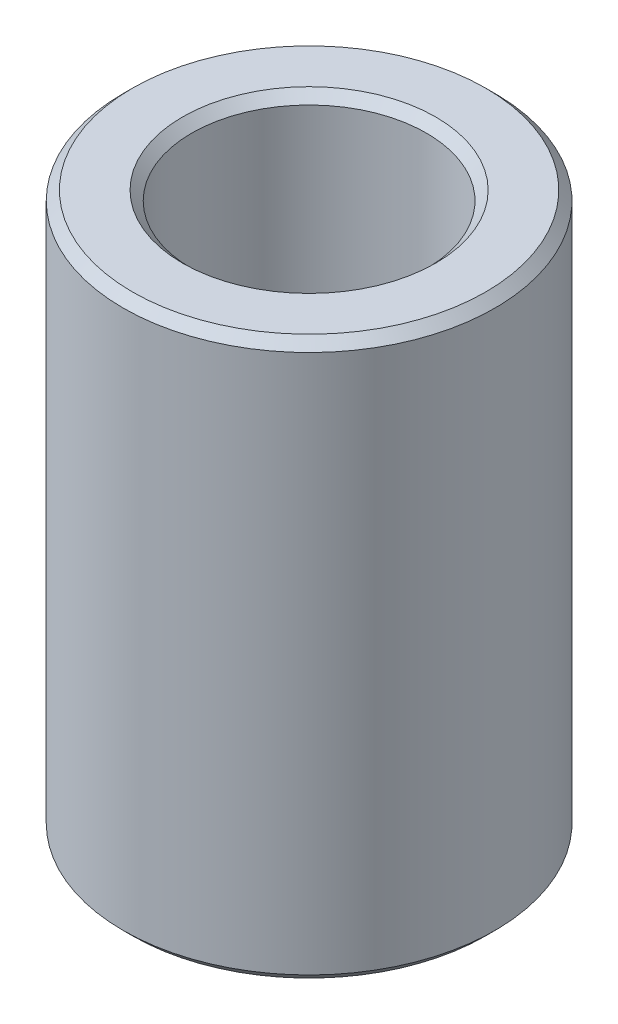
ISO-10303-21;
HEADER;
FILE_DESCRIPTION(('STEP AP214'),'2;1');
FILE_NAME('part.step','',(''),(''),'','','');
FILE_SCHEMA(('AUTOMOTIVE_DESIGN { 1 0 10303 214 1 1 1 1 }'));
ENDSEC;
DATA;
#1=APPLICATION_CONTEXT('core data for automotive mechanical design processes');
#2=APPLICATION_PROTOCOL_DEFINITION('international standard','automotive_design',2000,#1);
#3=PRODUCT_CONTEXT('',#1,'mechanical');
#4=PRODUCT('Part','Part','',(#3));
#5=PRODUCT_RELATED_PRODUCT_CATEGORY('part','',(#4));
#6=PRODUCT_DEFINITION_FORMATION('','',#4);
#7=PRODUCT_DEFINITION_CONTEXT('part definition',#1,'design');
#8=PRODUCT_DEFINITION('design','',#6,#7);
#9=PRODUCT_DEFINITION_SHAPE('','',#8);
#10=(LENGTH_UNIT() NAMED_UNIT(*) SI_UNIT(.MILLI.,.METRE.));
#11=(NAMED_UNIT(*) PLANE_ANGLE_UNIT() SI_UNIT($,.RADIAN.));
#12=(NAMED_UNIT(*) SI_UNIT($,.STERADIAN.) SOLID_ANGLE_UNIT());
#13=UNCERTAINTY_MEASURE_WITH_UNIT(LENGTH_MEASURE(1.E-05),#10,'distance_accuracy_value','');
#14=(GEOMETRIC_REPRESENTATION_CONTEXT(3) GLOBAL_UNCERTAINTY_ASSIGNED_CONTEXT((#13)) GLOBAL_UNIT_ASSIGNED_CONTEXT((#10,
#11,#12)) REPRESENTATION_CONTEXT('',''));
#15=CARTESIAN_POINT('',(0.,0.,0.));
#16=DIRECTION('',(0.,0.,1.));
#17=DIRECTION('',(1.,0.,0.));
#18=AXIS2_PLACEMENT_3D('',#15,#16,#17);
#19=CARTESIAN_POINT('',(0.,0.1000000001101,0.));
#20=DIRECTION('',(0.,-1.,0.));
#21=DIRECTION('',(0.,0.,-1.));
#22=AXIS2_PLACEMENT_3D('',#19,#20,#21);
#23=CONICAL_SURFACE('',#22,2.62499999989,0.785398163397448);
#24=CARTESIAN_POINT('',(0.,0.2,0.));
#25=DIRECTION('',(0.,1.,0.));
#26=DIRECTION('',(-1.,0.,0.));
#27=AXIS2_PLACEMENT_3D('',#24,#25,#26);
#28=CIRCLE('',#27,2.525);
#29=CARTESIAN_POINT('',(0.,0.20000000000005,2.52500000000005));
#30=VERTEX_POINT('',#29);
#31=CARTESIAN_POINT('',(-2.525,0.2,0.));
#32=VERTEX_POINT('',#31);
#33=EDGE_CURVE('E156',#30,#32,#28,.T.);
#34=ORIENTED_EDGE('',*,*,#33,.T.);
#35=CARTESIAN_POINT('',(0.,0.2,0.));
#36=DIRECTION('',(0.,1.,0.));
#37=DIRECTION('',(-1.,0.,0.));
#38=AXIS2_PLACEMENT_3D('',#35,#36,#37);
#39=CIRCLE('',#38,2.525);
#40=EDGE_CURVE('E158',#32,#30,#39,.T.);
#41=ORIENTED_EDGE('',*,*,#40,.T.);
#42=DIRECTION('',(0.,-0.707106781186548,0.707106781186548));
#43=VECTOR('',#42,1.);
#44=CARTESIAN_POINT('',(0.,0.1000000001101,2.62499999989));
#45=LINE('',#44,#43);
#46=CARTESIAN_POINT('',(0.,0.,2.72500000000005));
#47=VERTEX_POINT('',#46);
#48=EDGE_CURVE('E11',#30,#47,#45,.T.);
#49=ORIENTED_EDGE('',*,*,#48,.T.);
#50=CARTESIAN_POINT('',(0.,0.,0.));
#51=DIRECTION('',(0.,1.,0.));
#52=DIRECTION('',(1.,0.,0.));
#53=AXIS2_PLACEMENT_3D('',#50,#51,#52);
#54=CIRCLE('',#53,2.725);
#55=EDGE_CURVE('E167',#47,#47,#54,.T.);
#56=ORIENTED_EDGE('',*,*,#55,.F.);
#57=ORIENTED_EDGE('',*,*,#48,.F.);
#58=EDGE_LOOP('',(#34,#41,#49,#56,#57));
#59=FACE_BOUND('',#58,.T.);
#60=ADVANCED_FACE('F17',(#59),#23,.F.);
#61=CARTESIAN_POINT('',(0.,-0.6,0.));
#62=DIRECTION('',(0.,1.,0.));
#63=DIRECTION('',(1.,0.,0.));
#64=AXIS2_PLACEMENT_3D('',#61,#62,#63);
#65=CYLINDRICAL_SURFACE('',#64,2.525);
#66=ORIENTED_EDGE('',*,*,#33,.F.);
#67=ORIENTED_EDGE('',*,*,#40,.F.);
#68=DIRECTION('',(0.,1.,0.));
#69=VECTOR('',#68,1.);
#70=CARTESIAN_POINT('',(-2.525,-0.6,0.));
#71=LINE('',#70,#69);
#72=CARTESIAN_POINT('',(-2.525,4.,0.));
#73=VERTEX_POINT('',#72);
#74=EDGE_CURVE('E27',#32,#73,#71,.T.);
#75=ORIENTED_EDGE('',*,*,#74,.T.);
#76=CARTESIAN_POINT('',(0.,4.,0.));
#77=DIRECTION('',(0.,-1.,0.));
#78=DIRECTION('',(1.,0.,0.));
#79=AXIS2_PLACEMENT_3D('',#76,#77,#78);
#80=CIRCLE('',#79,2.525);
#81=EDGE_CURVE('E159',#73,#73,#80,.T.);
#82=ORIENTED_EDGE('',*,*,#81,.F.);
#83=ORIENTED_EDGE('',*,*,#74,.F.);
#84=EDGE_LOOP('',(#66,#67,#75,#82,#83));
#85=FACE_BOUND('',#84,.T.);
#86=ADVANCED_FACE('F201',(#85),#65,.F.);
#87=CARTESIAN_POINT('',(0.,4.,0.));
#88=DIRECTION('',(0.,1.,0.));
#89=DIRECTION('',(1.,0.,0.));
#90=AXIS2_PLACEMENT_3D('',#87,#88,#89);
#91=PLANE('',#90);
#92=CARTESIAN_POINT('',(0.,4.,0.));
#93=DIRECTION('',(0.,-1.,0.));
#94=DIRECTION('',(1.,0.,0.));
#95=AXIS2_PLACEMENT_3D('',#92,#93,#94);
#96=CIRCLE('',#95,2.);
#97=CARTESIAN_POINT('',(-2.,4.,0.));
#98=VERTEX_POINT('',#97);
#99=EDGE_CURVE('E161',#98,#98,#96,.T.);
#100=ORIENTED_EDGE('',*,*,#99,.F.);
#101=EDGE_LOOP('',(#100));
#102=FACE_BOUND('',#101,.T.);
#103=ORIENTED_EDGE('',*,*,#81,.T.);
#104=EDGE_LOOP('',(#103));
#105=FACE_BOUND('',#104,.T.);
#106=ADVANCED_FACE('F206',(#102,#105),#91,.F.);
#107=CARTESIAN_POINT('',(0.,-0.6,0.));
#108=DIRECTION('',(0.,1.,0.));
#109=DIRECTION('',(1.,0.,0.));
#110=AXIS2_PLACEMENT_3D('',#107,#108,#109);
#111=CYLINDRICAL_SURFACE('',#110,2.);
#112=ORIENTED_EDGE('',*,*,#99,.T.);
#113=DIRECTION('',(0.,1.,0.));
#114=VECTOR('',#113,1.);
#115=CARTESIAN_POINT('',(-2.,-0.6,0.));
#116=LINE('',#115,#114);
#117=CARTESIAN_POINT('',(-2.,5.,0.));
#118=VERTEX_POINT('',#117);
#119=EDGE_CURVE('E164',#98,#118,#116,.T.);
#120=ORIENTED_EDGE('',*,*,#119,.T.);
#121=CARTESIAN_POINT('',(0.,5.,0.));
#122=DIRECTION('',(0.,-1.,0.));
#123=DIRECTION('',(1.,0.,0.));
#124=AXIS2_PLACEMENT_3D('',#121,#122,#123);
#125=CIRCLE('',#124,2.);
#126=EDGE_CURVE('E165',#118,#118,#125,.T.);
#127=ORIENTED_EDGE('',*,*,#126,.F.);
#128=ORIENTED_EDGE('',*,*,#119,.F.);
#129=EDGE_LOOP('',(#112,#120,#127,#128));
#130=FACE_BOUND('',#129,.T.);
#131=ADVANCED_FACE('F225',(#130),#111,.F.);
#132=CARTESIAN_POINT('',(0.,5.,0.));
#133=DIRECTION('',(0.,1.,0.));
#134=DIRECTION('',(1.,0.,0.));
#135=AXIS2_PLACEMENT_3D('',#132,#133,#134);
#136=PLANE('',#135);
#137=ORIENTED_EDGE('',*,*,#126,.T.);
#138=EDGE_LOOP('',(#137));
#139=FACE_BOUND('',#138,.T.);
#140=CARTESIAN_POINT('',(0.,5.,0.));
#141=DIRECTION('',(0.,-1.,0.));
#142=DIRECTION('',(1.,0.,0.));
#143=AXIS2_PLACEMENT_3D('',#140,#141,#142);
#144=CIRCLE('',#143,2.525);
#145=CARTESIAN_POINT('',(-2.525,5.,0.));
#146=VERTEX_POINT('',#145);
#147=EDGE_CURVE('E151',#146,#146,#144,.T.);
#148=ORIENTED_EDGE('',*,*,#147,.F.);
#149=EDGE_LOOP('',(#148));
#150=FACE_BOUND('',#149,.T.);
#151=ADVANCED_FACE('F19',(#139,#150),#136,.T.);
#152=CARTESIAN_POINT('',(0.,-0.6,0.));
#153=DIRECTION('',(0.,1.,0.));
#154=DIRECTION('',(1.,0.,0.));
#155=AXIS2_PLACEMENT_3D('',#152,#153,#154);
#156=CYLINDRICAL_SURFACE('',#155,2.525);
#157=ORIENTED_EDGE('',*,*,#147,.T.);
#158=DIRECTION('',(0.,1.,0.));
#159=VECTOR('',#158,1.);
#160=CARTESIAN_POINT('',(-2.525,-0.6,0.));
#161=LINE('',#160,#159);
#162=CARTESIAN_POINT('',(-2.525,11.8,0.));
#163=VERTEX_POINT('',#162);
#164=EDGE_CURVE('E100',#146,#163,#161,.T.);
#165=ORIENTED_EDGE('',*,*,#164,.T.);
#166=CARTESIAN_POINT('',(0.,11.8,0.));
#167=DIRECTION('',(0.,1.,0.));
#168=DIRECTION('',(-1.,0.,0.));
#169=AXIS2_PLACEMENT_3D('',#166,#167,#168);
#170=CIRCLE('',#169,2.525);
#171=CARTESIAN_POINT('',(0.,11.799999999998,2.525000000002));
#172=VERTEX_POINT('',#171);
#173=EDGE_CURVE('E149',#163,#172,#170,.T.);
#174=ORIENTED_EDGE('',*,*,#173,.T.);
#175=CARTESIAN_POINT('',(0.,11.8,0.));
#176=DIRECTION('',(0.,1.,0.));
#177=DIRECTION('',(-1.,0.,0.));
#178=AXIS2_PLACEMENT_3D('',#175,#176,#177);
#179=CIRCLE('',#178,2.525);
#180=EDGE_CURVE('E148',#172,#163,#179,.T.);
#181=ORIENTED_EDGE('',*,*,#180,.T.);
#182=ORIENTED_EDGE('',*,*,#164,.F.);
#183=EDGE_LOOP('',(#157,#165,#174,#181,#182));
#184=FACE_BOUND('',#183,.T.);
#185=ADVANCED_FACE('F194',(#184),#156,.F.);
#186=CARTESIAN_POINT('',(0.,11.89999999993,0.));
#187=DIRECTION('',(0.,1.,0.));
#188=DIRECTION('',(0.,0.,-1.));
#189=AXIS2_PLACEMENT_3D('',#186,#187,#188);
#190=CONICAL_SURFACE('',#189,2.624999999934,0.785398163397448);
#191=ORIENTED_EDGE('',*,*,#180,.F.);
#192=DIRECTION('',(0.,0.707106781186548,0.707106781186548));
#193=VECTOR('',#192,1.);
#194=CARTESIAN_POINT('',(0.,11.89999999993,2.624999999934));
#195=LINE('',#194,#193);
#196=CARTESIAN_POINT('',(0.,11.999999999998,2.725000000002));
#197=VERTEX_POINT('',#196);
#198=EDGE_CURVE('E152',#172,#197,#195,.T.);
#199=ORIENTED_EDGE('',*,*,#198,.T.);
#200=CARTESIAN_POINT('',(0.,12.,0.));
#201=DIRECTION('',(0.,1.,0.));
#202=DIRECTION('',(-1.,0.,0.));
#203=AXIS2_PLACEMENT_3D('',#200,#201,#202);
#204=CIRCLE('',#203,2.725);
#205=EDGE_CURVE('E144',#197,#197,#204,.T.);
#206=ORIENTED_EDGE('',*,*,#205,.T.);
#207=ORIENTED_EDGE('',*,*,#198,.F.);
#208=ORIENTED_EDGE('',*,*,#173,.F.);
#209=EDGE_LOOP('',(#191,#199,#206,#207,#208));
#210=FACE_BOUND('',#209,.T.);
#211=ADVANCED_FACE('F186',(#210),#190,.F.);
#212=CARTESIAN_POINT('',(0.,12.,0.));
#213=DIRECTION('',(0.,1.,0.));
#214=DIRECTION('',(1.,0.,0.));
#215=AXIS2_PLACEMENT_3D('',#212,#213,#214);
#216=PLANE('',#215);
#217=ORIENTED_EDGE('',*,*,#205,.F.);
#218=EDGE_LOOP('',(#217));
#219=FACE_BOUND('',#218,.T.);
#220=CARTESIAN_POINT('',(0.,12.,0.));
#221=DIRECTION('',(0.,1.,0.));
#222=DIRECTION('',(1.,0.,0.));
#223=AXIS2_PLACEMENT_3D('',#220,#221,#222);
#224=CIRCLE('',#223,3.8);
#225=CARTESIAN_POINT('',(0.,11.9999999999975,3.7999999999975));
#226=VERTEX_POINT('',#225);
#227=EDGE_CURVE('E119',#226,#226,#224,.T.);
#228=ORIENTED_EDGE('',*,*,#227,.T.);
#229=EDGE_LOOP('',(#228));
#230=FACE_BOUND('',#229,.T.);
#231=ADVANCED_FACE('F184',(#219,#230),#216,.T.);
#232=CARTESIAN_POINT('',(0.,11.90000000003,0.));
#233=DIRECTION('',(0.,-1.,0.));
#234=DIRECTION('',(0.,0.,-1.));
#235=AXIS2_PLACEMENT_3D('',#232,#233,#234);
#236=CONICAL_SURFACE('',#235,3.899999999965,0.785398163397448);
#237=CARTESIAN_POINT('',(0.,11.8,0.));
#238=DIRECTION('',(0.,1.,0.));
#239=DIRECTION('',(1.,0.,0.));
#240=AXIS2_PLACEMENT_3D('',#237,#238,#239);
#241=CIRCLE('',#240,4.);
#242=CARTESIAN_POINT('',(-4.,11.8,0.));
#243=VERTEX_POINT('',#242);
#244=CARTESIAN_POINT('',(0.,11.7999999999975,3.9999999999975));
#245=VERTEX_POINT('',#244);
#246=EDGE_CURVE('E125',#243,#245,#241,.T.);
#247=ORIENTED_EDGE('',*,*,#246,.T.);
#248=DIRECTION('',(0.,0.707106781186548,-0.707106781186548));
#249=VECTOR('',#248,1.);
#250=CARTESIAN_POINT('',(0.,11.90000000003,3.899999999965));
#251=LINE('',#250,#249);
#252=EDGE_CURVE('E113',#245,#226,#251,.T.);
#253=ORIENTED_EDGE('',*,*,#252,.T.);
#254=ORIENTED_EDGE('',*,*,#227,.F.);
#255=ORIENTED_EDGE('',*,*,#252,.F.);
#256=CARTESIAN_POINT('',(0.,11.8,0.));
#257=DIRECTION('',(0.,1.,0.));
#258=DIRECTION('',(1.,0.,0.));
#259=AXIS2_PLACEMENT_3D('',#256,#257,#258);
#260=CIRCLE('',#259,4.);
#261=EDGE_CURVE('E117',#245,#243,#260,.T.);
#262=ORIENTED_EDGE('',*,*,#261,.T.);
#263=EDGE_LOOP('',(#247,#253,#254,#255,#262));
#264=FACE_BOUND('',#263,.T.);
#265=ADVANCED_FACE('F116',(#264),#236,.T.);
#266=CARTESIAN_POINT('',(0.,-0.6,0.));
#267=DIRECTION('',(0.,1.,0.));
#268=DIRECTION('',(1.,0.,0.));
#269=AXIS2_PLACEMENT_3D('',#266,#267,#268);
#270=CYLINDRICAL_SURFACE('',#269,4.);
#271=ORIENTED_EDGE('',*,*,#246,.F.);
#272=DIRECTION('',(0.,-1.,0.));
#273=VECTOR('',#272,1.);
#274=CARTESIAN_POINT('',(-4.,-0.6,0.));
#275=LINE('',#274,#273);
#276=CARTESIAN_POINT('',(-4.,0.2,0.));
#277=VERTEX_POINT('',#276);
#278=EDGE_CURVE('E127',#243,#277,#275,.T.);
#279=ORIENTED_EDGE('',*,*,#278,.T.);
#280=CARTESIAN_POINT('',(0.,0.2,0.));
#281=DIRECTION('',(0.,1.,0.));
#282=DIRECTION('',(1.,0.,0.));
#283=AXIS2_PLACEMENT_3D('',#280,#281,#282);
#284=CIRCLE('',#283,4.);
#285=CARTESIAN_POINT('',(0.,0.200000000000225,3.99999999999978));
#286=VERTEX_POINT('',#285);
#287=EDGE_CURVE('E171',#277,#286,#284,.T.);
#288=ORIENTED_EDGE('',*,*,#287,.T.);
#289=CARTESIAN_POINT('',(0.,0.2,0.));
#290=DIRECTION('',(0.,1.,0.));
#291=DIRECTION('',(1.,0.,0.));
#292=AXIS2_PLACEMENT_3D('',#289,#290,#291);
#293=CIRCLE('',#292,4.);
#294=EDGE_CURVE('E139',#286,#277,#293,.T.);
#295=ORIENTED_EDGE('',*,*,#294,.T.);
#296=ORIENTED_EDGE('',*,*,#278,.F.);
#297=ORIENTED_EDGE('',*,*,#261,.F.);
#298=EDGE_LOOP('',(#271,#279,#288,#295,#296,#297));
#299=FACE_BOUND('',#298,.T.);
#300=ADVANCED_FACE('F124',(#299),#270,.T.);
#301=CARTESIAN_POINT('',(0.,0.09999999997945,0.));
#302=DIRECTION('',(0.,1.,0.));
#303=DIRECTION('',(0.,0.,-1.));
#304=AXIS2_PLACEMENT_3D('',#301,#302,#303);
#305=CONICAL_SURFACE('',#304,3.899999999979,0.785398163397448);
#306=ORIENTED_EDGE('',*,*,#287,.F.);
#307=ORIENTED_EDGE('',*,*,#294,.F.);
#308=DIRECTION('',(0.,-0.707106781186548,-0.707106781186548));
#309=VECTOR('',#308,1.);
#310=CARTESIAN_POINT('',(0.,0.09999999997945,3.899999999979));
#311=LINE('',#310,#309);
#312=CARTESIAN_POINT('',(0.,2.24664037373756E-13,3.79999999999977));
#313=VERTEX_POINT('',#312);
#314=EDGE_CURVE('E131',#286,#313,#311,.T.);
#315=ORIENTED_EDGE('',*,*,#314,.T.);
#316=CARTESIAN_POINT('',(0.,0.,0.));
#317=DIRECTION('',(0.,1.,0.));
#318=DIRECTION('',(1.,0.,0.));
#319=AXIS2_PLACEMENT_3D('',#316,#317,#318);
#320=CIRCLE('',#319,3.8);
#321=EDGE_CURVE('E21',#313,#313,#320,.T.);
#322=ORIENTED_EDGE('',*,*,#321,.T.);
#323=ORIENTED_EDGE('',*,*,#314,.F.);
#324=EDGE_LOOP('',(#306,#307,#315,#322,#323));
#325=FACE_BOUND('',#324,.T.);
#326=ADVANCED_FACE('F210',(#325),#305,.T.);
#327=CARTESIAN_POINT('',(0.,0.,0.));
#328=DIRECTION('',(0.,1.,0.));
#329=DIRECTION('',(1.,0.,0.));
#330=AXIS2_PLACEMENT_3D('',#327,#328,#329);
#331=PLANE('',#330);
#332=ORIENTED_EDGE('',*,*,#55,.T.);
#333=EDGE_LOOP('',(#332));
#334=FACE_BOUND('',#333,.T.);
#335=ORIENTED_EDGE('',*,*,#321,.F.);
#336=EDGE_LOOP('',(#335));
#337=FACE_BOUND('',#336,.T.);
#338=ADVANCED_FACE('F214',(#334,#337),#331,.F.);
#339=CLOSED_SHELL('',(#60,#86,#106,#131,#151,#185,#211,#231,#265,#300,#326,#338));
#340=MANIFOLD_SOLID_BREP('B1',#339);
#341=ADVANCED_BREP_SHAPE_REPRESENTATION('',(#18,#340),#14);
#342=SHAPE_DEFINITION_REPRESENTATION(#9,#341);
ENDSEC;
END-ISO-10303-21;
